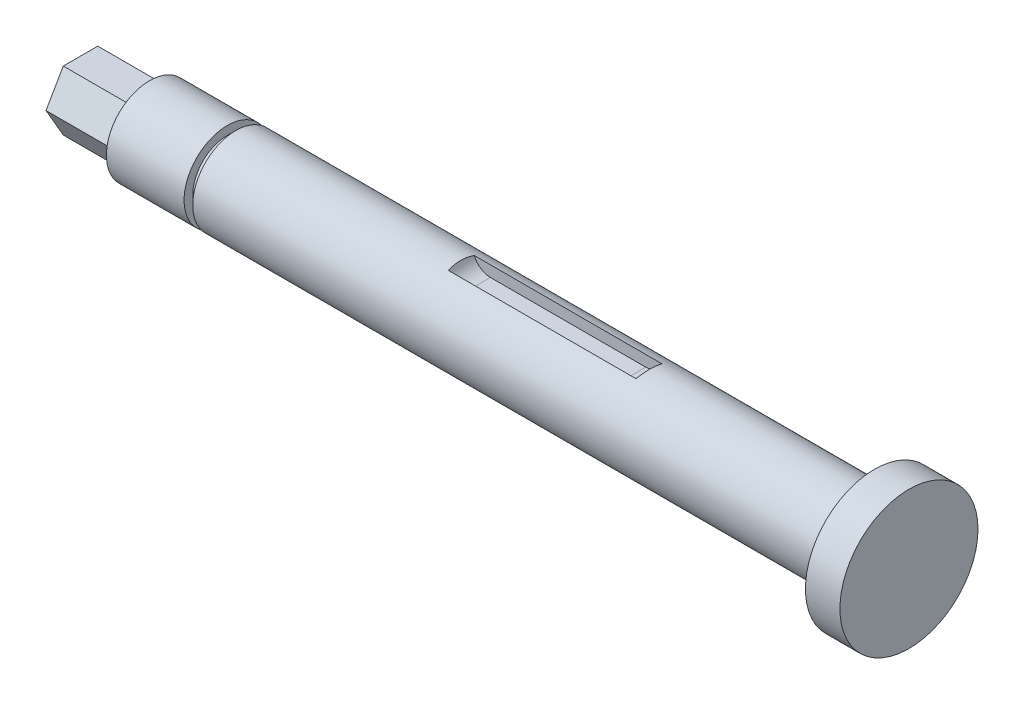
ISO-10303-21;
HEADER;
FILE_DESCRIPTION(('STEP AP214'),'2;1');
FILE_NAME('part.step','',(''),(''),'','','');
FILE_SCHEMA(('AUTOMOTIVE_DESIGN { 1 0 10303 214 1 1 1 1 }'));
ENDSEC;
DATA;
#1=APPLICATION_CONTEXT('core data for automotive mechanical design processes');
#2=APPLICATION_PROTOCOL_DEFINITION('international standard','automotive_design',2000,#1);
#3=PRODUCT_CONTEXT('',#1,'mechanical');
#4=PRODUCT('Part','Part','',(#3));
#5=PRODUCT_RELATED_PRODUCT_CATEGORY('part','',(#4));
#6=PRODUCT_DEFINITION_FORMATION('','',#4);
#7=PRODUCT_DEFINITION_CONTEXT('part definition',#1,'design');
#8=PRODUCT_DEFINITION('design','',#6,#7);
#9=PRODUCT_DEFINITION_SHAPE('','',#8);
#10=(LENGTH_UNIT() NAMED_UNIT(*) SI_UNIT(.MILLI.,.METRE.));
#11=(NAMED_UNIT(*) PLANE_ANGLE_UNIT() SI_UNIT($,.RADIAN.));
#12=(NAMED_UNIT(*) SI_UNIT($,.STERADIAN.) SOLID_ANGLE_UNIT());
#13=UNCERTAINTY_MEASURE_WITH_UNIT(LENGTH_MEASURE(1.E-05),#10,'distance_accuracy_value','');
#14=(GEOMETRIC_REPRESENTATION_CONTEXT(3) GLOBAL_UNCERTAINTY_ASSIGNED_CONTEXT((#13)) GLOBAL_UNIT_ASSIGNED_CONTEXT((#10,
#11,#12)) REPRESENTATION_CONTEXT('',''));
#15=CARTESIAN_POINT('',(0.,0.,0.));
#16=DIRECTION('',(0.,0.,1.));
#17=DIRECTION('',(1.,0.,0.));
#18=AXIS2_PLACEMENT_3D('',#15,#16,#17);
#19=CARTESIAN_POINT('',(0.,0.,0.));
#20=DIRECTION('',(1.,0.,0.));
#21=DIRECTION('',(0.,0.,-1.));
#22=AXIS2_PLACEMENT_3D('',#19,#20,#21);
#23=CYLINDRICAL_SURFACE('',#22,7.9375);
#24=CARTESIAN_POINT('',(28.575,0.,0.));
#25=DIRECTION('',(1.,0.,0.));
#26=DIRECTION('',(0.,0.,-1.));
#27=AXIS2_PLACEMENT_3D('',#24,#25,#26);
#28=CIRCLE('',#27,7.93749999999999);
#29=CARTESIAN_POINT('',(28.575,0.,-7.93749999999999));
#30=VERTEX_POINT('',#29);
#31=EDGE_CURVE('E188',#30,#30,#28,.T.);
#32=ORIENTED_EDGE('',*,*,#31,.T.);
#33=EDGE_LOOP('',(#32));
#34=FACE_BOUND('',#33,.T.);
#35=CARTESIAN_POINT('',(146.05,0.,0.));
#36=DIRECTION('',(1.,0.,0.));
#37=DIRECTION('',(0.,0.,-1.));
#38=AXIS2_PLACEMENT_3D('',#35,#36,#37);
#39=CIRCLE('',#38,7.93750000000001);
#40=CARTESIAN_POINT('',(146.05,0.,-7.93750000000001));
#41=VERTEX_POINT('',#40);
#42=EDGE_CURVE('E191',#41,#41,#39,.T.);
#43=ORIENTED_EDGE('',*,*,#42,.F.);
#44=EDGE_LOOP('',(#43));
#45=FACE_BOUND('',#44,.T.);
#46=CARTESIAN_POINT('',(70.0667575318649,7.57189241124701,-2.38125));
#47=CARTESIAN_POINT('',(70.0547077003656,7.60283748159561,-2.28286114644571));
#48=CARTESIAN_POINT('',(70.0439278662388,7.63190103640766,-2.18373394589652));
#49=CARTESIAN_POINT('',(70.0245768049551,7.68618284099055,-1.98423094459988));
#50=CARTESIAN_POINT('',(70.0160053112933,7.71140155461096,-1.88385529605055));
#51=CARTESIAN_POINT('',(70.0007406043774,7.75790730479949,-1.68210998868868));
#52=CARTESIAN_POINT('',(69.9940464557926,7.77919629741932,-1.58074085099974));
#53=CARTESIAN_POINT('',(69.9822696330404,7.81780480710201,-1.37716069329768));
#54=CARTESIAN_POINT('',(69.9771870047471,7.83512421116124,-1.2749496494035));
#55=CARTESIAN_POINT('',(69.9642408857745,7.88028783199856,-0.972518602068046));
#56=CARTESIAN_POINT('',(69.9583162704699,7.90252061667355,-0.771346365920785));
#57=CARTESIAN_POINT('',(69.9506794210857,7.93155475211319,-0.367812192026648));
#58=CARTESIAN_POINT('',(69.9489677390323,7.93835408060337,-0.165450101853552));
#59=CARTESIAN_POINT('',(69.949442775625,7.93650243379859,0.233209512953231));
#60=CARTESIAN_POINT('',(69.9515157047947,7.92830242011707,0.429509408207354));
#61=CARTESIAN_POINT('',(69.9596947493576,7.89737846148739,0.820870390108001));
#62=CARTESIAN_POINT('',(69.9658001587861,7.87465705881517,1.01593168756148));
#63=CARTESIAN_POINT('',(69.9788488663797,7.82945029286182,1.30909544958882));
#64=CARTESIAN_POINT('',(69.9839338818715,7.81224594563471,1.40812396106605));
#65=CARTESIAN_POINT('',(69.9956400417717,7.77410905883621,1.60537279101093));
#66=CARTESIAN_POINT('',(70.0022611439788,7.7531766216913,1.70359313160493));
#67=CARTESIAN_POINT('',(70.0172851652548,7.70762154640837,1.89909267282386));
#68=CARTESIAN_POINT('',(70.0256890236687,7.68299696487047,1.99637134891407));
#69=CARTESIAN_POINT('',(70.0445825527755,7.63013554179114,2.18974831448237));
#70=CARTESIAN_POINT('',(70.0550724600671,7.60189829063224,2.28584646875236));
#71=CARTESIAN_POINT('',(70.0667575318649,7.57189241124701,2.38125));
#72=B_SPLINE_CURVE_WITH_KNOTS('',3,(#46,#47,#48,#49,#50,#51,#52,#53,#54,#55,#56,#57,#58,#59,#60,
#61,#62,#63,#64,#65,#66,#67,#68,#69,#70,#71),.UNSPECIFIED.,.F.,.F.,(4,2,2,2,2,2,2,2,2,2,2,2,4),
(0.,0.311486004627485,0.622934401155594,0.934227351103225,1.24552916163332,1.85227877141674,
2.459107880142,3.04799138422071,3.63677182003085,3.93862384263224,4.24046757335365,
4.54247074416797,4.84450818758329),.UNSPECIFIED.);
#73=CARTESIAN_POINT('',(70.0667575318649,7.57189241124701,-2.38125));
#74=VERTEX_POINT('',#73);
#75=CARTESIAN_POINT('',(70.0667575318649,7.57189241124701,2.38125));
#76=VERTEX_POINT('',#75);
#77=EDGE_CURVE('E202',#74,#76,#72,.T.);
#78=ORIENTED_EDGE('',*,*,#77,.F.);
#79=DIRECTION('',(1.,0.,0.));
#80=VECTOR('',#79,1.);
#81=CARTESIAN_POINT('',(0.,7.57189241124701,-2.38125));
#82=LINE('',#81,#80);
#83=CARTESIAN_POINT('',(104.558242468135,7.57189241124701,-2.38125));
#84=VERTEX_POINT('',#83);
#85=EDGE_CURVE('E12',#74,#84,#82,.T.);
#86=ORIENTED_EDGE('',*,*,#85,.T.);
#87=CARTESIAN_POINT('',(104.558242468135,7.57189241124701,2.38125));
#88=CARTESIAN_POINT('',(104.570292299634,7.60283748159561,2.2828611464457));
#89=CARTESIAN_POINT('',(104.581072133761,7.63190103640766,2.18373394589652));
#90=CARTESIAN_POINT('',(104.600423195045,7.68618284099056,1.98423094459988));
#91=CARTESIAN_POINT('',(104.608994688707,7.71140155461096,1.88385529605055));
#92=CARTESIAN_POINT('',(104.624259395623,7.75790730479949,1.68210998868868));
#93=CARTESIAN_POINT('',(104.630953544207,7.77919629741933,1.58074085099974));
#94=CARTESIAN_POINT('',(104.64273036696,7.81780480710202,1.37716069329768));
#95=CARTESIAN_POINT('',(104.647812995253,7.83512421116124,1.2749496494035));
#96=CARTESIAN_POINT('',(104.660759114225,7.88028783199856,0.972518602068042));
#97=CARTESIAN_POINT('',(104.66668372953,7.90252061667355,0.77134636592078));
#98=CARTESIAN_POINT('',(104.674320578914,7.93155475211319,0.367812192026642));
#99=CARTESIAN_POINT('',(104.676032260968,7.93835408060337,0.165450101853546));
#100=CARTESIAN_POINT('',(104.675557224375,7.93650243379859,-0.233209512953238));
#101=CARTESIAN_POINT('',(104.673484295205,7.92830242011707,-0.42950940820736));
#102=CARTESIAN_POINT('',(104.665305250642,7.89737846148739,-0.820870390108006));
#103=CARTESIAN_POINT('',(104.659199841214,7.87465705881517,-1.01593168756148));
#104=CARTESIAN_POINT('',(104.64615113362,7.82945029286181,-1.30909544958883));
#105=CARTESIAN_POINT('',(104.641066118128,7.81224594563471,-1.40812396106605));
#106=CARTESIAN_POINT('',(104.629359958228,7.77410905883621,-1.60537279101093));
#107=CARTESIAN_POINT('',(104.622738856021,7.7531766216913,-1.70359313160493));
#108=CARTESIAN_POINT('',(104.607714834745,7.70762154640837,-1.89909267282386));
#109=CARTESIAN_POINT('',(104.599310976331,7.68299696487047,-1.99637134891407));
#110=CARTESIAN_POINT('',(104.580417447224,7.63013554179114,-2.18974831448237));
#111=CARTESIAN_POINT('',(104.569927539933,7.60189829063224,-2.28584646875237));
#112=CARTESIAN_POINT('',(104.558242468135,7.57189241124701,-2.38125));
#113=B_SPLINE_CURVE_WITH_KNOTS('',3,(#87,#88,#89,#90,#91,#92,#93,#94,#95,#96,#97,#98,#99,#100,
#101,#102,#103,#104,#105,#106,#107,#108,#109,#110,#111,#112),.UNSPECIFIED.,.F.,.F.,(4,2,2,2,2,2,
2,2,2,2,2,2,4),(0.,0.311486004627485,0.622934401155594,0.934227351103226,1.24552916163332,
1.85227877141674,2.459107880142,3.04799138422071,3.63677182003086,3.93862384263224,
4.24046757335365,4.54247074416797,4.8445081875833),.UNSPECIFIED.);
#114=CARTESIAN_POINT('',(104.558242468135,7.57189241124701,2.38125));
#115=VERTEX_POINT('',#114);
#116=EDGE_CURVE('E43',#115,#84,#113,.T.);
#117=ORIENTED_EDGE('',*,*,#116,.F.);
#118=DIRECTION('',(1.,0.,0.));
#119=VECTOR('',#118,1.);
#120=CARTESIAN_POINT('',(0.,7.57189241124701,2.38125));
#121=LINE('',#120,#119);
#122=EDGE_CURVE('E200',#76,#115,#121,.T.);
#123=ORIENTED_EDGE('',*,*,#122,.F.);
#124=EDGE_LOOP('',(#78,#86,#117,#123));
#125=FACE_BOUND('',#124,.T.);
#126=ADVANCED_FACE('F35',(#34,#45,#125),#23,.T.);
#127=CARTESIAN_POINT('',(152.4,0.,0.));
#128=DIRECTION('',(1.,0.,0.));
#129=DIRECTION('',(0.,0.,-1.));
#130=AXIS2_PLACEMENT_3D('',#127,#128,#129);
#131=PLANE('',#130);
#132=CARTESIAN_POINT('',(152.4,0.,0.));
#133=DIRECTION('',(1.,0.,0.));
#134=DIRECTION('',(0.,0.,-1.));
#135=AXIS2_PLACEMENT_3D('',#132,#133,#134);
#136=CIRCLE('',#135,12.7);
#137=CARTESIAN_POINT('',(152.4,0.,-12.7));
#138=VERTEX_POINT('',#137);
#139=EDGE_CURVE('E197',#138,#138,#136,.T.);
#140=ORIENTED_EDGE('',*,*,#139,.T.);
#141=EDGE_LOOP('',(#140));
#142=FACE_BOUND('',#141,.T.);
#143=ADVANCED_FACE('F37',(#142),#131,.T.);
#144=CARTESIAN_POINT('',(0.,0.,0.));
#145=DIRECTION('',(1.,0.,0.));
#146=DIRECTION('',(0.,0.,-1.));
#147=AXIS2_PLACEMENT_3D('',#144,#145,#146);
#148=CYLINDRICAL_SURFACE('',#147,12.7);
#149=CARTESIAN_POINT('',(146.05,0.,0.));
#150=DIRECTION('',(1.,0.,0.));
#151=DIRECTION('',(0.,0.,-1.));
#152=AXIS2_PLACEMENT_3D('',#149,#150,#151);
#153=CIRCLE('',#152,12.7);
#154=CARTESIAN_POINT('',(146.05,0.,-12.7));
#155=VERTEX_POINT('',#154);
#156=EDGE_CURVE('E194',#155,#155,#153,.T.);
#157=ORIENTED_EDGE('',*,*,#156,.T.);
#158=EDGE_LOOP('',(#157));
#159=FACE_BOUND('',#158,.T.);
#160=ORIENTED_EDGE('',*,*,#139,.F.);
#161=EDGE_LOOP('',(#160));
#162=FACE_BOUND('',#161,.T.);
#163=ADVANCED_FACE('F249',(#159,#162),#148,.T.);
#164=CARTESIAN_POINT('',(146.05,12.7,0.));
#165=DIRECTION('',(-1.,0.,0.));
#166=DIRECTION('',(0.,0.,1.));
#167=AXIS2_PLACEMENT_3D('',#164,#165,#166);
#168=PLANE('',#167);
#169=ORIENTED_EDGE('',*,*,#42,.T.);
#170=EDGE_LOOP('',(#169));
#171=FACE_BOUND('',#170,.T.);
#172=ORIENTED_EDGE('',*,*,#156,.F.);
#173=EDGE_LOOP('',(#172));
#174=FACE_BOUND('',#173,.T.);
#175=ADVANCED_FACE('F244',(#171,#174),#168,.T.);
#176=CARTESIAN_POINT('',(28.575,6.34999999999999,0.));
#177=DIRECTION('',(-1.,0.,0.));
#178=DIRECTION('',(0.,0.,1.));
#179=AXIS2_PLACEMENT_3D('',#176,#177,#178);
#180=PLANE('',#179);
#181=CARTESIAN_POINT('',(28.575,0.,0.));
#182=DIRECTION('',(1.,0.,0.));
#183=DIRECTION('',(0.,0.,-1.));
#184=AXIS2_PLACEMENT_3D('',#181,#182,#183);
#185=CIRCLE('',#184,6.34999999999999);
#186=CARTESIAN_POINT('',(28.575,0.,-6.34999999999999));
#187=VERTEX_POINT('',#186);
#188=EDGE_CURVE('E185',#187,#187,#185,.T.);
#189=ORIENTED_EDGE('',*,*,#188,.T.);
#190=EDGE_LOOP('',(#189));
#191=FACE_BOUND('',#190,.T.);
#192=ORIENTED_EDGE('',*,*,#31,.F.);
#193=EDGE_LOOP('',(#192));
#194=FACE_BOUND('',#193,.T.);
#195=ADVANCED_FACE('F241',(#191,#194),#180,.T.);
#196=CARTESIAN_POINT('',(0.,0.,0.));
#197=DIRECTION('',(1.,0.,0.));
#198=DIRECTION('',(0.,0.,-1.));
#199=AXIS2_PLACEMENT_3D('',#196,#197,#198);
#200=CYLINDRICAL_SURFACE('',#199,6.34999999999999);
#201=CARTESIAN_POINT('',(26.9875,0.,0.));
#202=DIRECTION('',(1.,0.,0.));
#203=DIRECTION('',(0.,0.,-1.));
#204=AXIS2_PLACEMENT_3D('',#201,#202,#203);
#205=CIRCLE('',#204,6.34999999999999);
#206=CARTESIAN_POINT('',(26.9875,0.,-6.34999999999999));
#207=VERTEX_POINT('',#206);
#208=EDGE_CURVE('E182',#207,#207,#205,.T.);
#209=ORIENTED_EDGE('',*,*,#208,.T.);
#210=EDGE_LOOP('',(#209));
#211=FACE_BOUND('',#210,.T.);
#212=ORIENTED_EDGE('',*,*,#188,.F.);
#213=EDGE_LOOP('',(#212));
#214=FACE_BOUND('',#213,.T.);
#215=ADVANCED_FACE('F238',(#211,#214),#200,.T.);
#216=CARTESIAN_POINT('',(26.9875,7.9375,0.));
#217=DIRECTION('',(1.,0.,0.));
#218=DIRECTION('',(0.,0.,-1.));
#219=AXIS2_PLACEMENT_3D('',#216,#217,#218);
#220=PLANE('',#219);
#221=CARTESIAN_POINT('',(26.9875,0.,0.));
#222=DIRECTION('',(1.,0.,0.));
#223=DIRECTION('',(0.,0.,-1.));
#224=AXIS2_PLACEMENT_3D('',#221,#222,#223);
#225=CIRCLE('',#224,7.9375);
#226=CARTESIAN_POINT('',(26.9875,0.,-7.9375));
#227=VERTEX_POINT('',#226);
#228=EDGE_CURVE('E179',#227,#227,#225,.T.);
#229=ORIENTED_EDGE('',*,*,#228,.T.);
#230=EDGE_LOOP('',(#229));
#231=FACE_BOUND('',#230,.T.);
#232=ORIENTED_EDGE('',*,*,#208,.F.);
#233=EDGE_LOOP('',(#232));
#234=FACE_BOUND('',#233,.T.);
#235=ADVANCED_FACE('F234',(#231,#234),#220,.T.);
#236=CARTESIAN_POINT('',(0.,0.,0.));
#237=DIRECTION('',(1.,0.,0.));
#238=DIRECTION('',(0.,0.,-1.));
#239=AXIS2_PLACEMENT_3D('',#236,#237,#238);
#240=CYLINDRICAL_SURFACE('',#239,7.9375);
#241=CARTESIAN_POINT('',(12.7,0.,0.));
#242=DIRECTION('',(1.,0.,0.));
#243=DIRECTION('',(0.,0.,-1.));
#244=AXIS2_PLACEMENT_3D('',#241,#242,#243);
#245=CIRCLE('',#244,7.9375);
#246=CARTESIAN_POINT('',(12.7,0.,-7.9375));
#247=VERTEX_POINT('',#246);
#248=EDGE_CURVE('E174',#247,#247,#245,.T.);
#249=ORIENTED_EDGE('',*,*,#248,.T.);
#250=EDGE_LOOP('',(#249));
#251=FACE_BOUND('',#250,.T.);
#252=ORIENTED_EDGE('',*,*,#228,.F.);
#253=EDGE_LOOP('',(#252));
#254=FACE_BOUND('',#253,.T.);
#255=ADVANCED_FACE('F231',(#251,#254),#240,.T.);
#256=CARTESIAN_POINT('',(12.7,6.35,0.));
#257=DIRECTION('',(-1.,0.,0.));
#258=DIRECTION('',(0.,0.,1.));
#259=AXIS2_PLACEMENT_3D('',#256,#257,#258);
#260=PLANE('',#259);
#261=DIRECTION('',(0.,-0.866025403784439,0.5));
#262=VECTOR('',#261,1.);
#263=CARTESIAN_POINT('',(12.7,0.,6.35));
#264=LINE('',#263,#262);
#265=CARTESIAN_POINT('',(12.7,5.49926131403118,3.175));
#266=VERTEX_POINT('',#265);
#267=CARTESIAN_POINT('',(12.7,0.,6.35));
#268=VERTEX_POINT('',#267);
#269=EDGE_CURVE('E50',#266,#268,#264,.T.);
#270=ORIENTED_EDGE('',*,*,#269,.T.);
#271=DIRECTION('',(0.,-0.866025403784439,-0.5));
#272=VECTOR('',#271,1.);
#273=CARTESIAN_POINT('',(12.7,-5.49926131403118,3.175));
#274=LINE('',#273,#272);
#275=CARTESIAN_POINT('',(12.7,-5.49926131403118,3.175));
#276=VERTEX_POINT('',#275);
#277=EDGE_CURVE('E311',#268,#276,#274,.T.);
#278=ORIENTED_EDGE('',*,*,#277,.T.);
#279=DIRECTION('',(0.,0.,-1.));
#280=VECTOR('',#279,1.);
#281=CARTESIAN_POINT('',(12.7,-5.49926131403118,-3.175));
#282=LINE('',#281,#280);
#283=CARTESIAN_POINT('',(12.7,-5.49926131403118,-3.175));
#284=VERTEX_POINT('',#283);
#285=EDGE_CURVE('E315',#276,#284,#282,.T.);
#286=ORIENTED_EDGE('',*,*,#285,.T.);
#287=DIRECTION('',(0.,0.866025403784439,-0.5));
#288=VECTOR('',#287,1.);
#289=CARTESIAN_POINT('',(12.7,0.,-6.35));
#290=LINE('',#289,#288);
#291=CARTESIAN_POINT('',(12.7,0.,-6.35));
#292=VERTEX_POINT('',#291);
#293=EDGE_CURVE('E319',#284,#292,#290,.T.);
#294=ORIENTED_EDGE('',*,*,#293,.T.);
#295=DIRECTION('',(0.,0.866025403784439,0.5));
#296=VECTOR('',#295,1.);
#297=CARTESIAN_POINT('',(12.7,5.49926131403118,-3.175));
#298=LINE('',#297,#296);
#299=CARTESIAN_POINT('',(12.7,5.49926131403118,-3.175));
#300=VERTEX_POINT('',#299);
#301=EDGE_CURVE('E167',#292,#300,#298,.T.);
#302=ORIENTED_EDGE('',*,*,#301,.T.);
#303=DIRECTION('',(0.,0.,1.));
#304=VECTOR('',#303,1.);
#305=CARTESIAN_POINT('',(12.7,5.49926131403118,3.175));
#306=LINE('',#305,#304);
#307=EDGE_CURVE('E115',#300,#266,#306,.T.);
#308=ORIENTED_EDGE('',*,*,#307,.T.);
#309=EDGE_LOOP('',(#270,#278,#286,#294,#302,#308));
#310=FACE_BOUND('',#309,.T.);
#311=ORIENTED_EDGE('',*,*,#248,.F.);
#312=EDGE_LOOP('',(#311));
#313=FACE_BOUND('',#312,.T.);
#314=ADVANCED_FACE('F227',(#310,#313),#260,.T.);
#315=CARTESIAN_POINT('',(101.6,8.7249,-2.38125));
#316=DIRECTION('',(0.,0.,1.));
#317=DIRECTION('',(1.,0.,0.));
#318=AXIS2_PLACEMENT_3D('',#315,#316,#317);
#319=CYLINDRICAL_SURFACE('',#318,3.17500000000001);
#320=ORIENTED_EDGE('',*,*,#116,.T.);
#321=CARTESIAN_POINT('',(101.6,8.7249,-2.38125));
#322=DIRECTION('',(0.,0.,1.));
#323=DIRECTION('',(1.,0.,0.));
#324=AXIS2_PLACEMENT_3D('',#321,#322,#323);
#325=CIRCLE('',#324,3.17500000000001);
#326=CARTESIAN_POINT('',(101.6,5.5499,-2.38125));
#327=VERTEX_POINT('',#326);
#328=EDGE_CURVE('E160',#327,#84,#325,.T.);
#329=ORIENTED_EDGE('',*,*,#328,.F.);
#330=DIRECTION('',(0.,0.,1.));
#331=VECTOR('',#330,1.);
#332=CARTESIAN_POINT('',(101.6,5.5499,-2.38125));
#333=LINE('',#332,#331);
#334=CARTESIAN_POINT('',(101.6,5.5499,2.38125));
#335=VERTEX_POINT('',#334);
#336=EDGE_CURVE('E172',#327,#335,#333,.T.);
#337=ORIENTED_EDGE('',*,*,#336,.T.);
#338=CARTESIAN_POINT('',(101.6,8.7249,2.38125));
#339=DIRECTION('',(0.,0.,1.));
#340=DIRECTION('',(1.,0.,0.));
#341=AXIS2_PLACEMENT_3D('',#338,#339,#340);
#342=CIRCLE('',#341,3.17500000000001);
#343=EDGE_CURVE('E157',#335,#115,#342,.T.);
#344=ORIENTED_EDGE('',*,*,#343,.T.);
#345=EDGE_LOOP('',(#320,#329,#337,#344));
#346=FACE_BOUND('',#345,.T.);
#347=ADVANCED_FACE('F230',(#346),#319,.F.);
#348=CARTESIAN_POINT('',(73.025,5.5499,-2.38125));
#349=DIRECTION('',(0.,-1.,0.));
#350=DIRECTION('',(0.,0.,-1.));
#351=AXIS2_PLACEMENT_3D('',#348,#349,#350);
#352=PLANE('',#351);
#353=DIRECTION('',(1.,0.,0.));
#354=VECTOR('',#353,1.);
#355=CARTESIAN_POINT('',(73.025,5.5499,2.38125));
#356=LINE('',#355,#354);
#357=CARTESIAN_POINT('',(73.025,5.54990000000001,2.38125));
#358=VERTEX_POINT('',#357);
#359=EDGE_CURVE('E166',#358,#335,#356,.T.);
#360=ORIENTED_EDGE('',*,*,#359,.T.);
#361=ORIENTED_EDGE('',*,*,#336,.F.);
#362=DIRECTION('',(1.,0.,0.));
#363=VECTOR('',#362,1.);
#364=CARTESIAN_POINT('',(73.025,5.5499,-2.38125));
#365=LINE('',#364,#363);
#366=CARTESIAN_POINT('',(73.025,5.54990000000001,-2.38125));
#367=VERTEX_POINT('',#366);
#368=EDGE_CURVE('E156',#367,#327,#365,.T.);
#369=ORIENTED_EDGE('',*,*,#368,.F.);
#370=DIRECTION('',(0.,0.,1.));
#371=VECTOR('',#370,1.);
#372=CARTESIAN_POINT('',(73.025,5.54990000000001,-2.38125));
#373=LINE('',#372,#371);
#374=EDGE_CURVE('E163',#367,#358,#373,.T.);
#375=ORIENTED_EDGE('',*,*,#374,.T.);
#376=EDGE_LOOP('',(#360,#361,#369,#375));
#377=FACE_BOUND('',#376,.T.);
#378=ADVANCED_FACE('F222',(#377),#352,.F.);
#379=CARTESIAN_POINT('',(73.025,8.7249,-2.38125));
#380=DIRECTION('',(0.,0.,1.));
#381=DIRECTION('',(1.,0.,0.));
#382=AXIS2_PLACEMENT_3D('',#379,#380,#381);
#383=CYLINDRICAL_SURFACE('',#382,3.17499999999999);
#384=ORIENTED_EDGE('',*,*,#77,.T.);
#385=CARTESIAN_POINT('',(73.025,8.7249,2.38125));
#386=DIRECTION('',(0.,0.,1.));
#387=DIRECTION('',(1.,0.,0.));
#388=AXIS2_PLACEMENT_3D('',#385,#386,#387);
#389=CIRCLE('',#388,3.17499999999999);
#390=EDGE_CURVE('E164',#76,#358,#389,.T.);
#391=ORIENTED_EDGE('',*,*,#390,.T.);
#392=ORIENTED_EDGE('',*,*,#374,.F.);
#393=CARTESIAN_POINT('',(73.025,8.7249,-2.38125));
#394=DIRECTION('',(0.,0.,1.));
#395=DIRECTION('',(1.,0.,0.));
#396=AXIS2_PLACEMENT_3D('',#393,#394,#395);
#397=CIRCLE('',#396,3.17499999999999);
#398=EDGE_CURVE('E154',#74,#367,#397,.T.);
#399=ORIENTED_EDGE('',*,*,#398,.F.);
#400=EDGE_LOOP('',(#384,#391,#392,#399));
#401=FACE_BOUND('',#400,.T.);
#402=ADVANCED_FACE('F216',(#401),#383,.F.);
#403=CARTESIAN_POINT('',(73.025,8.7249,-2.38125));
#404=DIRECTION('',(0.,0.,1.));
#405=DIRECTION('',(1.,0.,0.));
#406=AXIS2_PLACEMENT_3D('',#403,#404,#405);
#407=PLANE('',#406);
#408=ORIENTED_EDGE('',*,*,#398,.T.);
#409=ORIENTED_EDGE('',*,*,#368,.T.);
#410=ORIENTED_EDGE('',*,*,#328,.T.);
#411=ORIENTED_EDGE('',*,*,#85,.F.);
#412=EDGE_LOOP('',(#408,#409,#410,#411));
#413=FACE_BOUND('',#412,.T.);
#414=ADVANCED_FACE('F221',(#413),#407,.T.);
#415=CARTESIAN_POINT('',(73.025,8.7249,2.38125));
#416=DIRECTION('',(0.,0.,1.));
#417=DIRECTION('',(1.,0.,0.));
#418=AXIS2_PLACEMENT_3D('',#415,#416,#417);
#419=PLANE('',#418);
#420=ORIENTED_EDGE('',*,*,#122,.T.);
#421=ORIENTED_EDGE('',*,*,#343,.F.);
#422=ORIENTED_EDGE('',*,*,#359,.F.);
#423=ORIENTED_EDGE('',*,*,#390,.F.);
#424=EDGE_LOOP('',(#420,#421,#422,#423));
#425=FACE_BOUND('',#424,.T.);
#426=ADVANCED_FACE('F274',(#425),#419,.F.);
#427=CARTESIAN_POINT('',(56.5795209628125,5.49926131403118,3.175));
#428=DIRECTION('',(0.,1.,0.));
#429=DIRECTION('',(0.,0.,1.));
#430=AXIS2_PLACEMENT_3D('',#427,#428,#429);
#431=PLANE('',#430);
#432=DIRECTION('',(-1.,0.,0.));
#433=VECTOR('',#432,1.);
#434=CARTESIAN_POINT('',(56.5795209628125,5.49926131403118,-3.175));
#435=LINE('',#434,#433);
#436=CARTESIAN_POINT('',(0.,5.49926131403118,-3.175));
#437=VERTEX_POINT('',#436);
#438=EDGE_CURVE('E112',#300,#437,#435,.T.);
#439=ORIENTED_EDGE('',*,*,#438,.T.);
#440=DIRECTION('',(0.,0.,-1.));
#441=VECTOR('',#440,1.);
#442=CARTESIAN_POINT('',(0.,5.49926131403118,3.175));
#443=LINE('',#442,#441);
#444=CARTESIAN_POINT('',(0.,5.49926131403119,3.175));
#445=VERTEX_POINT('',#444);
#446=EDGE_CURVE('E58',#445,#437,#443,.T.);
#447=ORIENTED_EDGE('',*,*,#446,.F.);
#448=DIRECTION('',(-1.,0.,0.));
#449=VECTOR('',#448,1.);
#450=CARTESIAN_POINT('',(56.5795209628125,5.49926131403118,3.175));
#451=LINE('',#450,#449);
#452=EDGE_CURVE('E119',#266,#445,#451,.T.);
#453=ORIENTED_EDGE('',*,*,#452,.F.);
#454=ORIENTED_EDGE('',*,*,#307,.F.);
#455=EDGE_LOOP('',(#439,#447,#453,#454));
#456=FACE_BOUND('',#455,.T.);
#457=ADVANCED_FACE('F114',(#456),#431,.T.);
#458=CARTESIAN_POINT('',(56.5795209628125,5.49926131403118,-3.175));
#459=DIRECTION('',(0.,0.5,-0.866025403784439));
#460=DIRECTION('',(0.,0.866025403784439,0.5));
#461=AXIS2_PLACEMENT_3D('',#458,#459,#460);
#462=PLANE('',#461);
#463=DIRECTION('',(-1.,0.,0.));
#464=VECTOR('',#463,1.);
#465=CARTESIAN_POINT('',(56.5795209628125,0.,-6.35));
#466=LINE('',#465,#464);
#467=CARTESIAN_POINT('',(0.,0.,-6.35));
#468=VERTEX_POINT('',#467);
#469=EDGE_CURVE('E118',#292,#468,#466,.T.);
#470=ORIENTED_EDGE('',*,*,#469,.T.);
#471=DIRECTION('',(0.,-0.866025403784439,-0.5));
#472=VECTOR('',#471,1.);
#473=CARTESIAN_POINT('',(0.,5.49926131403118,-3.175));
#474=LINE('',#473,#472);
#475=EDGE_CURVE('E122',#437,#468,#474,.T.);
#476=ORIENTED_EDGE('',*,*,#475,.F.);
#477=ORIENTED_EDGE('',*,*,#438,.F.);
#478=ORIENTED_EDGE('',*,*,#301,.F.);
#479=EDGE_LOOP('',(#470,#476,#477,#478));
#480=FACE_BOUND('',#479,.T.);
#481=ADVANCED_FACE('F123',(#480),#462,.T.);
#482=CARTESIAN_POINT('',(56.5795209628125,0.,-6.35));
#483=DIRECTION('',(0.,-0.5,-0.866025403784438));
#484=DIRECTION('',(0.,0.866025403784439,-0.5));
#485=AXIS2_PLACEMENT_3D('',#482,#483,#484);
#486=PLANE('',#485);
#487=DIRECTION('',(-1.,0.,0.));
#488=VECTOR('',#487,1.);
#489=CARTESIAN_POINT('',(56.5795209628125,-5.49926131403118,-3.175));
#490=LINE('',#489,#488);
#491=CARTESIAN_POINT('',(0.,-5.49926131403118,-3.175));
#492=VERTEX_POINT('',#491);
#493=EDGE_CURVE('E149',#284,#492,#490,.T.);
#494=ORIENTED_EDGE('',*,*,#493,.T.);
#495=DIRECTION('',(0.,-0.866025403784438,0.5));
#496=VECTOR('',#495,1.);
#497=CARTESIAN_POINT('',(0.,0.,-6.35));
#498=LINE('',#497,#496);
#499=EDGE_CURVE('E128',#468,#492,#498,.T.);
#500=ORIENTED_EDGE('',*,*,#499,.F.);
#501=ORIENTED_EDGE('',*,*,#469,.F.);
#502=ORIENTED_EDGE('',*,*,#293,.F.);
#503=EDGE_LOOP('',(#494,#500,#501,#502));
#504=FACE_BOUND('',#503,.T.);
#505=ADVANCED_FACE('F296',(#504),#486,.T.);
#506=CARTESIAN_POINT('',(56.5795209628125,-5.49926131403118,-3.175));
#507=DIRECTION('',(0.,-1.,0.));
#508=DIRECTION('',(0.,0.,-1.));
#509=AXIS2_PLACEMENT_3D('',#506,#507,#508);
#510=PLANE('',#509);
#511=DIRECTION('',(-1.,0.,0.));
#512=VECTOR('',#511,1.);
#513=CARTESIAN_POINT('',(56.5795209628125,-5.49926131403118,3.175));
#514=LINE('',#513,#512);
#515=CARTESIAN_POINT('',(0.,-5.49926131403118,3.175));
#516=VERTEX_POINT('',#515);
#517=EDGE_CURVE('E147',#276,#516,#514,.T.);
#518=ORIENTED_EDGE('',*,*,#517,.T.);
#519=DIRECTION('',(0.,0.,1.));
#520=VECTOR('',#519,1.);
#521=CARTESIAN_POINT('',(0.,-5.49926131403118,-3.175));
#522=LINE('',#521,#520);
#523=EDGE_CURVE('E140',#492,#516,#522,.T.);
#524=ORIENTED_EDGE('',*,*,#523,.F.);
#525=ORIENTED_EDGE('',*,*,#493,.F.);
#526=ORIENTED_EDGE('',*,*,#285,.F.);
#527=EDGE_LOOP('',(#518,#524,#525,#526));
#528=FACE_BOUND('',#527,.T.);
#529=ADVANCED_FACE('F299',(#528),#510,.T.);
#530=CARTESIAN_POINT('',(56.5795209628125,-5.49926131403118,3.175));
#531=DIRECTION('',(0.,-0.5,0.866025403784439));
#532=DIRECTION('',(0.,-0.866025403784439,-0.5));
#533=AXIS2_PLACEMENT_3D('',#530,#531,#532);
#534=PLANE('',#533);
#535=DIRECTION('',(-1.,0.,0.));
#536=VECTOR('',#535,1.);
#537=CARTESIAN_POINT('',(56.5795209628125,0.,6.35));
#538=LINE('',#537,#536);
#539=CARTESIAN_POINT('',(0.,0.,6.35));
#540=VERTEX_POINT('',#539);
#541=EDGE_CURVE('E145',#268,#540,#538,.T.);
#542=ORIENTED_EDGE('',*,*,#541,.T.);
#543=DIRECTION('',(0.,0.866025403784439,0.5));
#544=VECTOR('',#543,1.);
#545=CARTESIAN_POINT('',(0.,-5.49926131403118,3.175));
#546=LINE('',#545,#544);
#547=EDGE_CURVE('E143',#516,#540,#546,.T.);
#548=ORIENTED_EDGE('',*,*,#547,.F.);
#549=ORIENTED_EDGE('',*,*,#517,.F.);
#550=ORIENTED_EDGE('',*,*,#277,.F.);
#551=EDGE_LOOP('',(#542,#548,#549,#550));
#552=FACE_BOUND('',#551,.T.);
#553=ADVANCED_FACE('F290',(#552),#534,.T.);
#554=CARTESIAN_POINT('',(56.5795209628125,0.,6.35));
#555=DIRECTION('',(0.,0.5,0.866025403784439));
#556=DIRECTION('',(0.,-0.866025403784439,0.5));
#557=AXIS2_PLACEMENT_3D('',#554,#555,#556);
#558=PLANE('',#557);
#559=ORIENTED_EDGE('',*,*,#452,.T.);
#560=DIRECTION('',(0.,0.866025403784439,-0.5));
#561=VECTOR('',#560,1.);
#562=CARTESIAN_POINT('',(0.,0.,6.35));
#563=LINE('',#562,#561);
#564=EDGE_CURVE('E134',#540,#445,#563,.T.);
#565=ORIENTED_EDGE('',*,*,#564,.F.);
#566=ORIENTED_EDGE('',*,*,#541,.F.);
#567=ORIENTED_EDGE('',*,*,#269,.F.);
#568=EDGE_LOOP('',(#559,#565,#566,#567));
#569=FACE_BOUND('',#568,.T.);
#570=ADVANCED_FACE('F226',(#569),#558,.T.);
#571=CARTESIAN_POINT('',(0.,0.,0.));
#572=DIRECTION('',(-1.,0.,0.));
#573=DIRECTION('',(0.,0.,1.));
#574=AXIS2_PLACEMENT_3D('',#571,#572,#573);
#575=PLANE('',#574);
#576=ORIENTED_EDGE('',*,*,#564,.T.);
#577=ORIENTED_EDGE('',*,*,#446,.T.);
#578=ORIENTED_EDGE('',*,*,#475,.T.);
#579=ORIENTED_EDGE('',*,*,#499,.T.);
#580=ORIENTED_EDGE('',*,*,#523,.T.);
#581=ORIENTED_EDGE('',*,*,#547,.T.);
#582=EDGE_LOOP('',(#576,#577,#578,#579,#580,#581));
#583=FACE_BOUND('',#582,.T.);
#584=ADVANCED_FACE('F131',(#583),#575,.T.);
#585=CLOSED_SHELL('',(#126,#143,#163,#175,#195,#215,#235,#255,#314,#347,#378,#402,#414,#426,
#457,#481,#505,#529,#553,#570,#584));
#586=MANIFOLD_SOLID_BREP('B2',#585);
#587=ADVANCED_BREP_SHAPE_REPRESENTATION('',(#18,#586),#14);
#588=SHAPE_DEFINITION_REPRESENTATION(#9,#587);
ENDSEC;
END-ISO-10303-21;
